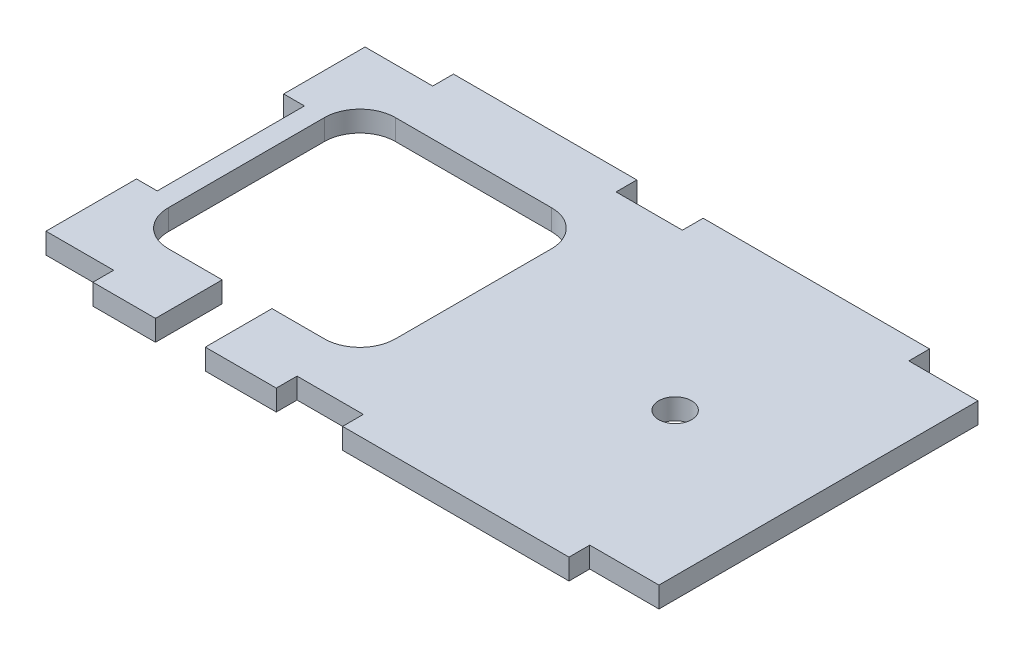
ISO-10303-21;
HEADER;
FILE_DESCRIPTION(('STEP AP214'),'2;1');
FILE_NAME('part.step','',(''),(''),'','','');
FILE_SCHEMA(('AUTOMOTIVE_DESIGN { 1 0 10303 214 1 1 1 1 }'));
ENDSEC;
DATA;
#1=APPLICATION_CONTEXT('core data for automotive mechanical design processes');
#2=APPLICATION_PROTOCOL_DEFINITION('international standard','automotive_design',2000,#1);
#3=PRODUCT_CONTEXT('',#1,'mechanical');
#4=PRODUCT('Part','Part','',(#3));
#5=PRODUCT_RELATED_PRODUCT_CATEGORY('part','',(#4));
#6=PRODUCT_DEFINITION_FORMATION('','',#4);
#7=PRODUCT_DEFINITION_CONTEXT('part definition',#1,'design');
#8=PRODUCT_DEFINITION('design','',#6,#7);
#9=PRODUCT_DEFINITION_SHAPE('','',#8);
#10=(LENGTH_UNIT() NAMED_UNIT(*) SI_UNIT(.MILLI.,.METRE.));
#11=(NAMED_UNIT(*) PLANE_ANGLE_UNIT() SI_UNIT($,.RADIAN.));
#12=(NAMED_UNIT(*) SI_UNIT($,.STERADIAN.) SOLID_ANGLE_UNIT());
#13=UNCERTAINTY_MEASURE_WITH_UNIT(LENGTH_MEASURE(1.E-05),#10,'distance_accuracy_value','');
#14=(GEOMETRIC_REPRESENTATION_CONTEXT(3) GLOBAL_UNCERTAINTY_ASSIGNED_CONTEXT((#13)) GLOBAL_UNIT_ASSIGNED_CONTEXT((#10,
#11,#12)) REPRESENTATION_CONTEXT('',''));
#15=CARTESIAN_POINT('',(0.,0.,0.));
#16=DIRECTION('',(0.,0.,1.));
#17=DIRECTION('',(1.,0.,0.));
#18=AXIS2_PLACEMENT_3D('',#15,#16,#17);
#19=CARTESIAN_POINT('',(86.36,0.,-50.8));
#20=DIRECTION('',(0.,-1.,0.));
#21=DIRECTION('',(0.,0.,-1.));
#22=AXIS2_PLACEMENT_3D('',#19,#20,#21);
#23=PLANE('',#22);
#24=DIRECTION('',(1.,0.,0.));
#25=VECTOR('',#24,1.);
#26=CARTESIAN_POINT('',(86.36,0.,-22.0231196297328));
#27=LINE('',#26,#25);
#28=CARTESIAN_POINT('',(-86.36,0.,-22.0231196297328));
#29=VERTEX_POINT('',#28);
#30=CARTESIAN_POINT('',(-80.51,0.,-22.0231196297328));
#31=VERTEX_POINT('',#30);
#32=EDGE_CURVE('E389',#29,#31,#27,.T.);
#33=ORIENTED_EDGE('',*,*,#32,.F.);
#34=DIRECTION('',(0.,0.,1.));
#35=VECTOR('',#34,1.);
#36=CARTESIAN_POINT('',(-86.36,0.,50.8));
#37=LINE('',#36,#35);
#38=CARTESIAN_POINT('',(-86.36,0.,-44.95));
#39=VERTEX_POINT('',#38);
#40=EDGE_CURVE('E537',#39,#29,#37,.T.);
#41=ORIENTED_EDGE('',*,*,#40,.F.);
#42=DIRECTION('',(1.,0.,0.));
#43=VECTOR('',#42,1.);
#44=CARTESIAN_POINT('',(86.36,0.,-44.95));
#45=LINE('',#44,#43);
#46=CARTESIAN_POINT('',(-67.2933113520948,0.,-44.95));
#47=VERTEX_POINT('',#46);
#48=EDGE_CURVE('E556',#39,#47,#45,.T.);
#49=ORIENTED_EDGE('',*,*,#48,.T.);
#50=DIRECTION('',(0.,0.,-1.));
#51=VECTOR('',#50,1.);
#52=CARTESIAN_POINT('',(-67.2933113520947,0.,-50.8));
#53=LINE('',#52,#51);
#54=CARTESIAN_POINT('',(-67.2933113520948,0.,-50.8));
#55=VERTEX_POINT('',#54);
#56=EDGE_CURVE('E401',#47,#55,#53,.T.);
#57=ORIENTED_EDGE('',*,*,#56,.T.);
#58=DIRECTION('',(-1.,0.,0.));
#59=VECTOR('',#58,1.);
#60=CARTESIAN_POINT('',(-86.36,0.,-50.8));
#61=LINE('',#60,#59);
#62=CARTESIAN_POINT('',(-15.6247389259285,0.,-50.8));
#63=VERTEX_POINT('',#62);
#64=EDGE_CURVE('E539',#63,#55,#61,.T.);
#65=ORIENTED_EDGE('',*,*,#64,.F.);
#66=DIRECTION('',(0.,0.,1.));
#67=VECTOR('',#66,1.);
#68=CARTESIAN_POINT('',(-15.6247389259285,0.,-50.8));
#69=LINE('',#68,#67);
#70=CARTESIAN_POINT('',(-15.6247389259285,0.,-44.95));
#71=VERTEX_POINT('',#70);
#72=EDGE_CURVE('E398',#63,#71,#69,.T.);
#73=ORIENTED_EDGE('',*,*,#72,.T.);
#74=CARTESIAN_POINT('',(3.06081199953051,0.,-44.95));
#75=VERTEX_POINT('',#74);
#76=EDGE_CURVE('E554',#71,#75,#45,.T.);
#77=ORIENTED_EDGE('',*,*,#76,.T.);
#78=DIRECTION('',(0.,0.,-1.));
#79=VECTOR('',#78,1.);
#80=CARTESIAN_POINT('',(3.06081199953051,0.,-50.8));
#81=LINE('',#80,#79);
#82=CARTESIAN_POINT('',(3.06081199953051,0.,-50.8));
#83=VERTEX_POINT('',#82);
#84=EDGE_CURVE('E395',#75,#83,#81,.T.);
#85=ORIENTED_EDGE('',*,*,#84,.T.);
#86=CARTESIAN_POINT('',(66.8582900899251,0.,-50.8));
#87=VERTEX_POINT('',#86);
#88=EDGE_CURVE('E538',#87,#83,#61,.T.);
#89=ORIENTED_EDGE('',*,*,#88,.F.);
#90=DIRECTION('',(0.,0.,1.));
#91=VECTOR('',#90,1.);
#92=CARTESIAN_POINT('',(66.8582900899251,0.,-50.8));
#93=LINE('',#92,#91);
#94=CARTESIAN_POINT('',(66.8582900899251,0.,-44.95));
#95=VERTEX_POINT('',#94);
#96=EDGE_CURVE('E392',#87,#95,#93,.T.);
#97=ORIENTED_EDGE('',*,*,#96,.T.);
#98=CARTESIAN_POINT('',(86.36,0.,-44.95));
#99=VERTEX_POINT('',#98);
#100=EDGE_CURVE('E550',#95,#99,#45,.T.);
#101=ORIENTED_EDGE('',*,*,#100,.T.);
#102=DIRECTION('',(0.,0.,-1.));
#103=VECTOR('',#102,1.);
#104=CARTESIAN_POINT('',(86.36,0.,50.8));
#105=LINE('',#104,#103);
#106=CARTESIAN_POINT('',(86.36,0.,44.95));
#107=VERTEX_POINT('',#106);
#108=EDGE_CURVE('E479',#107,#99,#105,.T.);
#109=ORIENTED_EDGE('',*,*,#108,.F.);
#110=DIRECTION('',(1.,0.,0.));
#111=VECTOR('',#110,1.);
#112=CARTESIAN_POINT('',(86.36,0.,44.95));
#113=LINE('',#112,#111);
#114=CARTESIAN_POINT('',(66.8582900899251,0.,44.95));
#115=VERTEX_POINT('',#114);
#116=EDGE_CURVE('E54',#115,#107,#113,.T.);
#117=ORIENTED_EDGE('',*,*,#116,.F.);
#118=DIRECTION('',(0.,0.,1.));
#119=VECTOR('',#118,1.);
#120=CARTESIAN_POINT('',(66.8582900899251,0.,-50.8));
#121=LINE('',#120,#119);
#122=CARTESIAN_POINT('',(66.8582900899251,0.,50.8));
#123=VERTEX_POINT('',#122);
#124=EDGE_CURVE('E407',#115,#123,#121,.T.);
#125=ORIENTED_EDGE('',*,*,#124,.T.);
#126=DIRECTION('',(1.,0.,0.));
#127=VECTOR('',#126,1.);
#128=CARTESIAN_POINT('',(-86.36,0.,50.8));
#129=LINE('',#128,#127);
#130=CARTESIAN_POINT('',(3.06081199953051,0.,50.8));
#131=VERTEX_POINT('',#130);
#132=EDGE_CURVE('E292',#131,#123,#129,.T.);
#133=ORIENTED_EDGE('',*,*,#132,.F.);
#134=DIRECTION('',(0.,0.,-1.));
#135=VECTOR('',#134,1.);
#136=CARTESIAN_POINT('',(3.06081199953051,0.,-50.8));
#137=LINE('',#136,#135);
#138=CARTESIAN_POINT('',(3.06081199953051,0.,44.95));
#139=VERTEX_POINT('',#138);
#140=EDGE_CURVE('E46',#131,#139,#137,.T.);
#141=ORIENTED_EDGE('',*,*,#140,.T.);
#142=CARTESIAN_POINT('',(-15.6247389259285,0.,44.95));
#143=VERTEX_POINT('',#142);
#144=EDGE_CURVE('E591',#143,#139,#113,.T.);
#145=ORIENTED_EDGE('',*,*,#144,.F.);
#146=DIRECTION('',(0.,0.,1.));
#147=VECTOR('',#146,1.);
#148=CARTESIAN_POINT('',(-15.6247389259285,0.,-50.8));
#149=LINE('',#148,#147);
#150=CARTESIAN_POINT('',(-15.6247389259285,0.,50.8));
#151=VERTEX_POINT('',#150);
#152=EDGE_CURVE('E410',#143,#151,#149,.T.);
#153=ORIENTED_EDGE('',*,*,#152,.T.);
#154=CARTESIAN_POINT('',(-35.6279249055484,0.,50.8));
#155=VERTEX_POINT('',#154);
#156=EDGE_CURVE('E533',#155,#151,#129,.T.);
#157=ORIENTED_EDGE('',*,*,#156,.F.);
#158=DIRECTION('',(0.,0.,-1.));
#159=VECTOR('',#158,1.);
#160=CARTESIAN_POINT('',(-35.6279249055484,0.,32.));
#161=LINE('',#160,#159);
#162=CARTESIAN_POINT('',(-35.6279249055484,0.,32.));
#163=VERTEX_POINT('',#162);
#164=EDGE_CURVE('E440',#155,#163,#161,.T.);
#165=ORIENTED_EDGE('',*,*,#164,.T.);
#166=DIRECTION('',(1.,0.,0.));
#167=VECTOR('',#166,1.);
#168=CARTESIAN_POINT('',(-10.8508253354387,0.,32.));
#169=LINE('',#168,#167);
#170=CARTESIAN_POINT('',(-20.8508253354387,0.,32.));
#171=VERTEX_POINT('',#170);
#172=EDGE_CURVE('E443',#163,#171,#169,.T.);
#173=ORIENTED_EDGE('',*,*,#172,.T.);
#174=CARTESIAN_POINT('',(-20.8508253354387,0.,22.));
#175=DIRECTION('',(0.,-1.,0.));
#176=DIRECTION('',(0.,0.,-1.));
#177=AXIS2_PLACEMENT_3D('',#174,#175,#176);
#178=CIRCLE('',#177,10.);
#179=CARTESIAN_POINT('',(-10.8508253354387,0.,22.));
#180=VERTEX_POINT('',#179);
#181=EDGE_CURVE('E506',#171,#180,#178,.F.);
#182=ORIENTED_EDGE('',*,*,#181,.T.);
#183=DIRECTION('',(0.,0.,-1.));
#184=VECTOR('',#183,1.);
#185=CARTESIAN_POINT('',(-10.8508253354387,0.,-32.));
#186=LINE('',#185,#184);
#187=CARTESIAN_POINT('',(-10.8508253354387,0.,-22.));
#188=VERTEX_POINT('',#187);
#189=EDGE_CURVE('E446',#180,#188,#186,.T.);
#190=ORIENTED_EDGE('',*,*,#189,.T.);
#191=CARTESIAN_POINT('',(-20.8508253354387,0.,-22.));
#192=DIRECTION('',(0.,-1.,0.));
#193=DIRECTION('',(0.,0.,-1.));
#194=AXIS2_PLACEMENT_3D('',#191,#192,#193);
#195=CIRCLE('',#194,10.);
#196=CARTESIAN_POINT('',(-20.8508253354387,0.,-32.));
#197=VERTEX_POINT('',#196);
#198=EDGE_CURVE('E502',#188,#197,#195,.F.);
#199=ORIENTED_EDGE('',*,*,#198,.T.);
#200=DIRECTION('',(-1.,0.,0.));
#201=VECTOR('',#200,1.);
#202=CARTESIAN_POINT('',(-74.8508253354387,0.,-32.));
#203=LINE('',#202,#201);
#204=CARTESIAN_POINT('',(-64.8508253354387,0.,-32.));
#205=VERTEX_POINT('',#204);
#206=EDGE_CURVE('E429',#197,#205,#203,.T.);
#207=ORIENTED_EDGE('',*,*,#206,.T.);
#208=CARTESIAN_POINT('',(-64.8508253354387,0.,-22.));
#209=DIRECTION('',(0.,-1.,0.));
#210=DIRECTION('',(0.,0.,-1.));
#211=AXIS2_PLACEMENT_3D('',#208,#209,#210);
#212=CIRCLE('',#211,10.);
#213=CARTESIAN_POINT('',(-74.8508253354387,0.,-22.));
#214=VERTEX_POINT('',#213);
#215=EDGE_CURVE('E498',#205,#214,#212,.F.);
#216=ORIENTED_EDGE('',*,*,#215,.T.);
#217=DIRECTION('',(0.,0.,1.));
#218=VECTOR('',#217,1.);
#219=CARTESIAN_POINT('',(-74.8508253354387,0.,32.));
#220=LINE('',#219,#218);
#221=CARTESIAN_POINT('',(-74.8508253354387,0.,22.));
#222=VERTEX_POINT('',#221);
#223=EDGE_CURVE('E432',#214,#222,#220,.T.);
#224=ORIENTED_EDGE('',*,*,#223,.T.);
#225=CARTESIAN_POINT('',(-64.8508253354387,0.,22.));
#226=DIRECTION('',(0.,-1.,0.));
#227=DIRECTION('',(0.,0.,-1.));
#228=AXIS2_PLACEMENT_3D('',#225,#226,#227);
#229=CIRCLE('',#228,10.);
#230=CARTESIAN_POINT('',(-64.8508253354387,0.,32.));
#231=VERTEX_POINT('',#230);
#232=EDGE_CURVE('E510',#222,#231,#229,.F.);
#233=ORIENTED_EDGE('',*,*,#232,.T.);
#234=DIRECTION('',(1.,0.,0.));
#235=VECTOR('',#234,1.);
#236=CARTESIAN_POINT('',(-49.6595750944517,0.,32.));
#237=LINE('',#236,#235);
#238=CARTESIAN_POINT('',(-49.6595750944517,0.,32.));
#239=VERTEX_POINT('',#238);
#240=EDGE_CURVE('E435',#231,#239,#237,.T.);
#241=ORIENTED_EDGE('',*,*,#240,.T.);
#242=DIRECTION('',(0.,0.,1.));
#243=VECTOR('',#242,1.);
#244=CARTESIAN_POINT('',(-49.6595750944517,0.,32.));
#245=LINE('',#244,#243);
#246=CARTESIAN_POINT('',(-49.6595750944517,0.,50.8));
#247=VERTEX_POINT('',#246);
#248=EDGE_CURVE('E437',#239,#247,#245,.T.);
#249=ORIENTED_EDGE('',*,*,#248,.T.);
#250=CARTESIAN_POINT('',(-67.2933113520948,0.,50.8));
#251=VERTEX_POINT('',#250);
#252=EDGE_CURVE('E484',#251,#247,#129,.T.);
#253=ORIENTED_EDGE('',*,*,#252,.F.);
#254=DIRECTION('',(0.,0.,-1.));
#255=VECTOR('',#254,1.);
#256=CARTESIAN_POINT('',(-67.2933113520947,0.,-50.8));
#257=LINE('',#256,#255);
#258=CARTESIAN_POINT('',(-67.2933113520948,0.,44.95));
#259=VERTEX_POINT('',#258);
#260=EDGE_CURVE('E413',#251,#259,#257,.T.);
#261=ORIENTED_EDGE('',*,*,#260,.T.);
#262=CARTESIAN_POINT('',(-86.36,0.,44.95));
#263=VERTEX_POINT('',#262);
#264=EDGE_CURVE('E587',#263,#259,#113,.T.);
#265=ORIENTED_EDGE('',*,*,#264,.F.);
#266=CARTESIAN_POINT('',(-86.36,0.,19.4523274550558));
#267=VERTEX_POINT('',#266);
#268=EDGE_CURVE('E534',#267,#263,#37,.T.);
#269=ORIENTED_EDGE('',*,*,#268,.F.);
#270=DIRECTION('',(-1.,0.,0.));
#271=VECTOR('',#270,1.);
#272=CARTESIAN_POINT('',(86.36,0.,19.4523274550558));
#273=LINE('',#272,#271);
#274=CARTESIAN_POINT('',(-80.51,0.,19.4523274550558));
#275=VERTEX_POINT('',#274);
#276=EDGE_CURVE('E387',#275,#267,#273,.T.);
#277=ORIENTED_EDGE('',*,*,#276,.F.);
#278=DIRECTION('',(0.,0.,1.));
#279=VECTOR('',#278,1.);
#280=CARTESIAN_POINT('',(-80.51,0.,-50.8));
#281=LINE('',#280,#279);
#282=EDGE_CURVE('E11',#31,#275,#281,.T.);
#283=ORIENTED_EDGE('',*,*,#282,.F.);
#284=EDGE_LOOP('',(#33,#41,#49,#57,#65,#73,#77,#85,#89,#97,#101,#109,#117,#125,#133,#141,#145,
#153,#157,#165,#173,#182,#190,#199,#207,#216,#224,#233,#241,#249,#253,#261,#265,#269,#277,#283));
#285=FACE_BOUND('',#284,.T.);
#286=CARTESIAN_POINT('',(45.9739194,0.,0.));
#287=DIRECTION('',(0.,1.,0.));
#288=DIRECTION('',(0.,0.,1.));
#289=AXIS2_PLACEMENT_3D('',#286,#287,#288);
#290=CIRCLE('',#289,4.635);
#291=CARTESIAN_POINT('',(45.9739194,0.,4.635));
#292=VERTEX_POINT('',#291);
#293=EDGE_CURVE('E421',#292,#292,#290,.T.);
#294=ORIENTED_EDGE('',*,*,#293,.T.);
#295=EDGE_LOOP('',(#294));
#296=FACE_BOUND('',#295,.T.);
#297=ADVANCED_FACE('F31',(#285,#296),#23,.T.);
#298=CARTESIAN_POINT('',(-86.36,5.85,50.8));
#299=DIRECTION('',(0.,0.,-1.));
#300=DIRECTION('',(-1.,0.,0.));
#301=AXIS2_PLACEMENT_3D('',#298,#299,#300);
#302=PLANE('',#301);
#303=DIRECTION('',(0.,-1.,0.));
#304=VECTOR('',#303,1.);
#305=CARTESIAN_POINT('',(-67.2933113520948,5.85000000000006,50.8));
#306=LINE('',#305,#304);
#307=CARTESIAN_POINT('',(-67.2933113520948,5.85,50.8));
#308=VERTEX_POINT('',#307);
#309=EDGE_CURVE('E310',#308,#251,#306,.T.);
#310=ORIENTED_EDGE('',*,*,#309,.T.);
#311=ORIENTED_EDGE('',*,*,#252,.T.);
#312=DIRECTION('',(0.,-1.,0.));
#313=VECTOR('',#312,1.);
#314=CARTESIAN_POINT('',(-49.6595750944517,20.,50.8));
#315=LINE('',#314,#313);
#316=CARTESIAN_POINT('',(-49.6595750944517,5.85,50.8));
#317=VERTEX_POINT('',#316);
#318=EDGE_CURVE('E454',#317,#247,#315,.T.);
#319=ORIENTED_EDGE('',*,*,#318,.F.);
#320=DIRECTION('',(1.,0.,0.));
#321=VECTOR('',#320,1.);
#322=CARTESIAN_POINT('',(-86.36,5.85,50.8));
#323=LINE('',#322,#321);
#324=EDGE_CURVE('E281',#308,#317,#323,.T.);
#325=ORIENTED_EDGE('',*,*,#324,.F.);
#326=EDGE_LOOP('',(#310,#311,#319,#325));
#327=FACE_BOUND('',#326,.T.);
#328=ADVANCED_FACE('F643',(#327),#302,.F.);
#329=DIRECTION('',(0.,1.,0.));
#330=VECTOR('',#329,1.);
#331=CARTESIAN_POINT('',(-15.6247389259285,5.85000000000006,50.8));
#332=LINE('',#331,#330);
#333=CARTESIAN_POINT('',(-15.6247389259285,5.85000000000006,50.8));
#334=VERTEX_POINT('',#333);
#335=EDGE_CURVE('E301',#151,#334,#332,.T.);
#336=ORIENTED_EDGE('',*,*,#335,.T.);
#337=CARTESIAN_POINT('',(-35.6279249055484,5.85,50.8));
#338=VERTEX_POINT('',#337);
#339=EDGE_CURVE('E278',#338,#334,#323,.T.);
#340=ORIENTED_EDGE('',*,*,#339,.F.);
#341=DIRECTION('',(0.,-1.,0.));
#342=VECTOR('',#341,1.);
#343=CARTESIAN_POINT('',(-35.6279249055484,20.,50.8));
#344=LINE('',#343,#342);
#345=EDGE_CURVE('E451',#338,#155,#344,.T.);
#346=ORIENTED_EDGE('',*,*,#345,.T.);
#347=ORIENTED_EDGE('',*,*,#156,.T.);
#348=EDGE_LOOP('',(#336,#340,#346,#347));
#349=FACE_BOUND('',#348,.T.);
#350=ADVANCED_FACE('F648',(#349),#302,.F.);
#351=DIRECTION('',(0.,-1.,0.));
#352=VECTOR('',#351,1.);
#353=CARTESIAN_POINT('',(3.06081199953051,5.85000000000006,50.8));
#354=LINE('',#353,#352);
#355=CARTESIAN_POINT('',(3.06081199953051,5.85000000000006,50.8));
#356=VERTEX_POINT('',#355);
#357=EDGE_CURVE('E296',#356,#131,#354,.T.);
#358=ORIENTED_EDGE('',*,*,#357,.T.);
#359=ORIENTED_EDGE('',*,*,#132,.T.);
#360=DIRECTION('',(0.,1.,0.));
#361=VECTOR('',#360,1.);
#362=CARTESIAN_POINT('',(66.8582900899251,5.85000000000006,50.8));
#363=LINE('',#362,#361);
#364=CARTESIAN_POINT('',(66.8582900899251,5.85000000000006,50.8));
#365=VERTEX_POINT('',#364);
#366=EDGE_CURVE('E285',#123,#365,#363,.T.);
#367=ORIENTED_EDGE('',*,*,#366,.T.);
#368=EDGE_CURVE('E266',#356,#365,#323,.T.);
#369=ORIENTED_EDGE('',*,*,#368,.F.);
#370=EDGE_LOOP('',(#358,#359,#367,#369));
#371=FACE_BOUND('',#370,.T.);
#372=ADVANCED_FACE('F290',(#371),#302,.F.);
#373=CARTESIAN_POINT('',(86.36,5.85,50.8));
#374=DIRECTION('',(-1.,0.,0.));
#375=DIRECTION('',(0.,0.,1.));
#376=AXIS2_PLACEMENT_3D('',#373,#374,#375);
#377=PLANE('',#376);
#378=DIRECTION('',(0.,1.,0.));
#379=VECTOR('',#378,1.);
#380=CARTESIAN_POINT('',(86.36,5.85000000000006,-44.95));
#381=LINE('',#380,#379);
#382=CARTESIAN_POINT('',(86.36,5.85,-44.95));
#383=VERTEX_POINT('',#382);
#384=EDGE_CURVE('E348',#99,#383,#381,.T.);
#385=ORIENTED_EDGE('',*,*,#384,.T.);
#386=DIRECTION('',(0.,0.,-1.));
#387=VECTOR('',#386,1.);
#388=CARTESIAN_POINT('',(86.36,5.85,50.8));
#389=LINE('',#388,#387);
#390=CARTESIAN_POINT('',(86.36,5.85,44.95));
#391=VERTEX_POINT('',#390);
#392=EDGE_CURVE('E480',#391,#383,#389,.T.);
#393=ORIENTED_EDGE('',*,*,#392,.F.);
#394=DIRECTION('',(0.,1.,0.));
#395=VECTOR('',#394,1.);
#396=CARTESIAN_POINT('',(86.36,5.85000000000006,44.95));
#397=LINE('',#396,#395);
#398=EDGE_CURVE('E313',#107,#391,#397,.T.);
#399=ORIENTED_EDGE('',*,*,#398,.F.);
#400=ORIENTED_EDGE('',*,*,#108,.T.);
#401=EDGE_LOOP('',(#385,#393,#399,#400));
#402=FACE_BOUND('',#401,.T.);
#403=ADVANCED_FACE('F544',(#402),#377,.F.);
#404=CARTESIAN_POINT('',(-86.36,5.85,-50.8));
#405=DIRECTION('',(0.,0.,1.));
#406=DIRECTION('',(1.,0.,0.));
#407=AXIS2_PLACEMENT_3D('',#404,#405,#406);
#408=PLANE('',#407);
#409=DIRECTION('',(0.,1.,0.));
#410=VECTOR('',#409,1.);
#411=CARTESIAN_POINT('',(-67.2933113520948,82.0500000000001,-50.8));
#412=LINE('',#411,#410);
#413=CARTESIAN_POINT('',(-67.2933113520948,5.84999999999999,-50.8));
#414=VERTEX_POINT('',#413);
#415=EDGE_CURVE('E354',#55,#414,#412,.T.);
#416=ORIENTED_EDGE('',*,*,#415,.T.);
#417=DIRECTION('',(-1.,0.,0.));
#418=VECTOR('',#417,1.);
#419=CARTESIAN_POINT('',(-86.36,5.85,-50.8));
#420=LINE('',#419,#418);
#421=CARTESIAN_POINT('',(-15.6247389259285,5.85000000000006,-50.8));
#422=VERTEX_POINT('',#421);
#423=EDGE_CURVE('E483',#422,#414,#420,.T.);
#424=ORIENTED_EDGE('',*,*,#423,.F.);
#425=DIRECTION('',(0.,-1.,0.));
#426=VECTOR('',#425,1.);
#427=CARTESIAN_POINT('',(-15.6247389259285,82.0500000000001,-50.8));
#428=LINE('',#427,#426);
#429=EDGE_CURVE('E342',#422,#63,#428,.T.);
#430=ORIENTED_EDGE('',*,*,#429,.T.);
#431=ORIENTED_EDGE('',*,*,#64,.T.);
#432=EDGE_LOOP('',(#416,#424,#430,#431));
#433=FACE_BOUND('',#432,.T.);
#434=ADVANCED_FACE('F619',(#433),#408,.F.);
#435=DIRECTION('',(0.,1.,0.));
#436=VECTOR('',#435,1.);
#437=CARTESIAN_POINT('',(3.06081199953049,82.05,-50.8));
#438=LINE('',#437,#436);
#439=CARTESIAN_POINT('',(3.06081199953051,5.85,-50.8));
#440=VERTEX_POINT('',#439);
#441=EDGE_CURVE('E334',#83,#440,#438,.T.);
#442=ORIENTED_EDGE('',*,*,#441,.T.);
#443=CARTESIAN_POINT('',(66.8582900899251,5.85000000000006,-50.8));
#444=VERTEX_POINT('',#443);
#445=EDGE_CURVE('E486',#444,#440,#420,.T.);
#446=ORIENTED_EDGE('',*,*,#445,.F.);
#447=DIRECTION('',(0.,-1.,0.));
#448=VECTOR('',#447,1.);
#449=CARTESIAN_POINT('',(66.8582900899251,82.0500000000001,-50.8));
#450=LINE('',#449,#448);
#451=EDGE_CURVE('E325',#444,#87,#450,.T.);
#452=ORIENTED_EDGE('',*,*,#451,.T.);
#453=ORIENTED_EDGE('',*,*,#88,.T.);
#454=EDGE_LOOP('',(#442,#446,#452,#453));
#455=FACE_BOUND('',#454,.T.);
#456=ADVANCED_FACE('F624',(#455),#408,.F.);
#457=CARTESIAN_POINT('',(-86.36,5.85,50.8));
#458=DIRECTION('',(1.,0.,0.));
#459=DIRECTION('',(0.,0.,-1.));
#460=AXIS2_PLACEMENT_3D('',#457,#458,#459);
#461=PLANE('',#460);
#462=ORIENTED_EDGE('',*,*,#40,.T.);
#463=DIRECTION('',(0.,-1.,0.));
#464=VECTOR('',#463,1.);
#465=CARTESIAN_POINT('',(-86.36,5.85000000000006,-22.0231196297328));
#466=LINE('',#465,#464);
#467=CARTESIAN_POINT('',(-86.36,5.85000000000006,-22.0231196297328));
#468=VERTEX_POINT('',#467);
#469=EDGE_CURVE('E360',#468,#29,#466,.T.);
#470=ORIENTED_EDGE('',*,*,#469,.F.);
#471=DIRECTION('',(0.,0.,1.));
#472=VECTOR('',#471,1.);
#473=CARTESIAN_POINT('',(-86.36,5.85,50.8));
#474=LINE('',#473,#472);
#475=CARTESIAN_POINT('',(-86.36,5.85000000000006,-44.95));
#476=VERTEX_POINT('',#475);
#477=EDGE_CURVE('E279',#476,#468,#474,.T.);
#478=ORIENTED_EDGE('',*,*,#477,.F.);
#479=DIRECTION('',(0.,-1.,0.));
#480=VECTOR('',#479,1.);
#481=CARTESIAN_POINT('',(-86.36,5.85000000000006,-44.95));
#482=LINE('',#481,#480);
#483=EDGE_CURVE('E351',#476,#39,#482,.T.);
#484=ORIENTED_EDGE('',*,*,#483,.T.);
#485=EDGE_LOOP('',(#462,#470,#478,#484));
#486=FACE_BOUND('',#485,.T.);
#487=ADVANCED_FACE('F601',(#486),#461,.F.);
#488=CARTESIAN_POINT('',(-86.36,5.85000000000006,19.4523274550558));
#489=VERTEX_POINT('',#488);
#490=CARTESIAN_POINT('',(-86.36,5.85,44.95));
#491=VERTEX_POINT('',#490);
#492=EDGE_CURVE('E491',#489,#491,#474,.T.);
#493=ORIENTED_EDGE('',*,*,#492,.F.);
#494=DIRECTION('',(0.,-1.,0.));
#495=VECTOR('',#494,1.);
#496=CARTESIAN_POINT('',(-86.36,5.85,19.4523274550558));
#497=LINE('',#496,#495);
#498=EDGE_CURVE('E39',#489,#267,#497,.T.);
#499=ORIENTED_EDGE('',*,*,#498,.T.);
#500=ORIENTED_EDGE('',*,*,#268,.T.);
#501=DIRECTION('',(0.,-1.,0.));
#502=VECTOR('',#501,1.);
#503=CARTESIAN_POINT('',(-86.36,5.85000000000006,44.95));
#504=LINE('',#503,#502);
#505=EDGE_CURVE('E315',#491,#263,#504,.T.);
#506=ORIENTED_EDGE('',*,*,#505,.F.);
#507=EDGE_LOOP('',(#493,#499,#500,#506));
#508=FACE_BOUND('',#507,.T.);
#509=ADVANCED_FACE('F582',(#508),#461,.F.);
#510=CARTESIAN_POINT('',(86.36,5.85,-50.8));
#511=DIRECTION('',(0.,-1.,0.));
#512=DIRECTION('',(0.,0.,-1.));
#513=AXIS2_PLACEMENT_3D('',#510,#511,#512);
#514=PLANE('',#513);
#515=DIRECTION('',(1.,0.,0.));
#516=VECTOR('',#515,1.);
#517=CARTESIAN_POINT('',(86.36,5.85,-44.95));
#518=LINE('',#517,#516);
#519=CARTESIAN_POINT('',(-15.6247389259285,5.85000000000006,-44.95));
#520=VERTEX_POINT('',#519);
#521=CARTESIAN_POINT('',(3.06081199953051,5.85000000000006,-44.95));
#522=VERTEX_POINT('',#521);
#523=EDGE_CURVE('E390',#520,#522,#518,.T.);
#524=ORIENTED_EDGE('',*,*,#523,.F.);
#525=DIRECTION('',(0.,0.,1.));
#526=VECTOR('',#525,1.);
#527=CARTESIAN_POINT('',(-15.6247389259285,5.85000000000006,-54.95));
#528=LINE('',#527,#526);
#529=EDGE_CURVE('E339',#422,#520,#528,.T.);
#530=ORIENTED_EDGE('',*,*,#529,.F.);
#531=ORIENTED_EDGE('',*,*,#423,.T.);
#532=DIRECTION('',(0.,0.,-1.));
#533=VECTOR('',#532,1.);
#534=CARTESIAN_POINT('',(-67.2933113520947,5.85,-50.8));
#535=LINE('',#534,#533);
#536=CARTESIAN_POINT('',(-67.2933113520948,5.85,-44.95));
#537=VERTEX_POINT('',#536);
#538=EDGE_CURVE('E404',#537,#414,#535,.T.);
#539=ORIENTED_EDGE('',*,*,#538,.F.);
#540=DIRECTION('',(-1.,0.,0.));
#541=VECTOR('',#540,1.);
#542=CARTESIAN_POINT('',(-86.36,5.85000000000006,-44.95));
#543=LINE('',#542,#541);
#544=EDGE_CURVE('E357',#537,#476,#543,.T.);
#545=ORIENTED_EDGE('',*,*,#544,.T.);
#546=ORIENTED_EDGE('',*,*,#477,.T.);
#547=DIRECTION('',(-1.,0.,0.));
#548=VECTOR('',#547,1.);
#549=CARTESIAN_POINT('',(-80.51,5.85000000000006,-22.0231196297328));
#550=LINE('',#549,#548);
#551=CARTESIAN_POINT('',(-80.51,5.85000000000006,-22.0231196297328));
#552=VERTEX_POINT('',#551);
#553=EDGE_CURVE('E366',#552,#468,#550,.T.);
#554=ORIENTED_EDGE('',*,*,#553,.F.);
#555=DIRECTION('',(0.,0.,1.));
#556=VECTOR('',#555,1.);
#557=CARTESIAN_POINT('',(-80.51,5.85,-50.8));
#558=LINE('',#557,#556);
#559=CARTESIAN_POINT('',(-80.51,5.85000000000006,19.4523274550558));
#560=VERTEX_POINT('',#559);
#561=EDGE_CURVE('E418',#552,#560,#558,.T.);
#562=ORIENTED_EDGE('',*,*,#561,.T.);
#563=DIRECTION('',(-1.,0.,0.));
#564=VECTOR('',#563,1.);
#565=CARTESIAN_POINT('',(-80.51,5.85000000000006,19.4523274550558));
#566=LINE('',#565,#564);
#567=EDGE_CURVE('E369',#560,#489,#566,.T.);
#568=ORIENTED_EDGE('',*,*,#567,.T.);
#569=ORIENTED_EDGE('',*,*,#492,.T.);
#570=DIRECTION('',(1.,0.,0.));
#571=VECTOR('',#570,1.);
#572=CARTESIAN_POINT('',(86.36,5.85,44.95));
#573=LINE('',#572,#571);
#574=CARTESIAN_POINT('',(-67.2933113520948,5.84999999999999,44.95));
#575=VERTEX_POINT('',#574);
#576=EDGE_CURVE('E555',#491,#575,#573,.T.);
#577=ORIENTED_EDGE('',*,*,#576,.T.);
#578=DIRECTION('',(0.,0.,-1.));
#579=VECTOR('',#578,1.);
#580=CARTESIAN_POINT('',(-67.2933113520947,5.85,-50.8));
#581=LINE('',#580,#579);
#582=EDGE_CURVE('E416',#308,#575,#581,.T.);
#583=ORIENTED_EDGE('',*,*,#582,.F.);
#584=ORIENTED_EDGE('',*,*,#324,.T.);
#585=DIRECTION('',(0.,0.,1.));
#586=VECTOR('',#585,1.);
#587=CARTESIAN_POINT('',(-49.6595750944517,5.85,-50.7999999999999));
#588=LINE('',#587,#586);
#589=CARTESIAN_POINT('',(-49.6595750944517,5.85,32.));
#590=VERTEX_POINT('',#589);
#591=EDGE_CURVE('E468',#590,#317,#588,.T.);
#592=ORIENTED_EDGE('',*,*,#591,.F.);
#593=DIRECTION('',(1.,0.,0.));
#594=VECTOR('',#593,1.);
#595=CARTESIAN_POINT('',(86.36,5.85,32.));
#596=LINE('',#595,#594);
#597=CARTESIAN_POINT('',(-64.8508253354387,5.85,32.));
#598=VERTEX_POINT('',#597);
#599=EDGE_CURVE('E471',#598,#590,#596,.T.);
#600=ORIENTED_EDGE('',*,*,#599,.F.);
#601=CARTESIAN_POINT('',(-64.8508253354387,5.85,22.));
#602=DIRECTION('',(0.,-1.,0.));
#603=DIRECTION('',(0.,0.,-1.));
#604=AXIS2_PLACEMENT_3D('',#601,#602,#603);
#605=CIRCLE('',#604,10.);
#606=CARTESIAN_POINT('',(-74.8508253354387,5.85,22.));
#607=VERTEX_POINT('',#606);
#608=EDGE_CURVE('E508',#598,#607,#605,.T.);
#609=ORIENTED_EDGE('',*,*,#608,.T.);
#610=DIRECTION('',(0.,0.,1.));
#611=VECTOR('',#610,1.);
#612=CARTESIAN_POINT('',(-74.8508253354387,5.85,-50.8));
#613=LINE('',#612,#611);
#614=CARTESIAN_POINT('',(-74.8508253354387,5.85,-22.));
#615=VERTEX_POINT('',#614);
#616=EDGE_CURVE('E473',#615,#607,#613,.T.);
#617=ORIENTED_EDGE('',*,*,#616,.F.);
#618=CARTESIAN_POINT('',(-64.8508253354387,5.85,-22.));
#619=DIRECTION('',(0.,-1.,0.));
#620=DIRECTION('',(0.,0.,-1.));
#621=AXIS2_PLACEMENT_3D('',#618,#619,#620);
#622=CIRCLE('',#621,10.);
#623=CARTESIAN_POINT('',(-64.8508253354387,5.85,-32.));
#624=VERTEX_POINT('',#623);
#625=EDGE_CURVE('E496',#615,#624,#622,.T.);
#626=ORIENTED_EDGE('',*,*,#625,.T.);
#627=DIRECTION('',(-1.,0.,0.));
#628=VECTOR('',#627,1.);
#629=CARTESIAN_POINT('',(86.36,5.85,-31.9999999999999));
#630=LINE('',#629,#628);
#631=CARTESIAN_POINT('',(-20.8508253354387,5.85,-32.));
#632=VERTEX_POINT('',#631);
#633=EDGE_CURVE('E476',#632,#624,#630,.T.);
#634=ORIENTED_EDGE('',*,*,#633,.F.);
#635=CARTESIAN_POINT('',(-20.8508253354387,5.85,-22.));
#636=DIRECTION('',(0.,-1.,0.));
#637=DIRECTION('',(0.,0.,-1.));
#638=AXIS2_PLACEMENT_3D('',#635,#636,#637);
#639=CIRCLE('',#638,10.);
#640=CARTESIAN_POINT('',(-10.8508253354387,5.85,-22.));
#641=VERTEX_POINT('',#640);
#642=EDGE_CURVE('E500',#632,#641,#639,.T.);
#643=ORIENTED_EDGE('',*,*,#642,.T.);
#644=DIRECTION('',(0.,0.,-1.));
#645=VECTOR('',#644,1.);
#646=CARTESIAN_POINT('',(-10.8508253354387,5.85,-50.8));
#647=LINE('',#646,#645);
#648=CARTESIAN_POINT('',(-10.8508253354387,5.85,22.));
#649=VERTEX_POINT('',#648);
#650=EDGE_CURVE('E460',#649,#641,#647,.T.);
#651=ORIENTED_EDGE('',*,*,#650,.F.);
#652=CARTESIAN_POINT('',(-20.8508253354387,5.85,22.));
#653=DIRECTION('',(0.,-1.,0.));
#654=DIRECTION('',(0.,0.,-1.));
#655=AXIS2_PLACEMENT_3D('',#652,#653,#654);
#656=CIRCLE('',#655,10.);
#657=CARTESIAN_POINT('',(-20.8508253354387,5.85,32.));
#658=VERTEX_POINT('',#657);
#659=EDGE_CURVE('E504',#649,#658,#656,.T.);
#660=ORIENTED_EDGE('',*,*,#659,.T.);
#661=DIRECTION('',(1.,0.,0.));
#662=VECTOR('',#661,1.);
#663=CARTESIAN_POINT('',(86.3599999999999,5.85,32.0000000000001));
#664=LINE('',#663,#662);
#665=CARTESIAN_POINT('',(-35.6279249055484,5.85,32.));
#666=VERTEX_POINT('',#665);
#667=EDGE_CURVE('E463',#666,#658,#664,.T.);
#668=ORIENTED_EDGE('',*,*,#667,.F.);
#669=DIRECTION('',(0.,0.,-1.));
#670=VECTOR('',#669,1.);
#671=CARTESIAN_POINT('',(-35.6279249055484,5.85,-50.7999999999999));
#672=LINE('',#671,#670);
#673=EDGE_CURVE('E466',#338,#666,#672,.T.);
#674=ORIENTED_EDGE('',*,*,#673,.F.);
#675=ORIENTED_EDGE('',*,*,#339,.T.);
#676=DIRECTION('',(0.,0.,1.));
#677=VECTOR('',#676,1.);
#678=CARTESIAN_POINT('',(-15.6247389259285,5.85000000000006,40.8));
#679=LINE('',#678,#677);
#680=CARTESIAN_POINT('',(-15.6247389259285,5.85000000000006,44.95));
#681=VERTEX_POINT('',#680);
#682=EDGE_CURVE('E304',#681,#334,#679,.T.);
#683=ORIENTED_EDGE('',*,*,#682,.F.);
#684=CARTESIAN_POINT('',(3.06081199953051,5.85000000000006,44.95));
#685=VERTEX_POINT('',#684);
#686=EDGE_CURVE('E559',#681,#685,#573,.T.);
#687=ORIENTED_EDGE('',*,*,#686,.T.);
#688=DIRECTION('',(0.,0.,1.));
#689=VECTOR('',#688,1.);
#690=CARTESIAN_POINT('',(3.06081199953051,5.85000000000006,40.8));
#691=LINE('',#690,#689);
#692=EDGE_CURVE('E275',#685,#356,#691,.T.);
#693=ORIENTED_EDGE('',*,*,#692,.T.);
#694=ORIENTED_EDGE('',*,*,#368,.T.);
#695=DIRECTION('',(0.,0.,1.));
#696=VECTOR('',#695,1.);
#697=CARTESIAN_POINT('',(66.8582900899251,5.85000000000006,40.8));
#698=LINE('',#697,#696);
#699=CARTESIAN_POINT('',(66.8582900899251,5.85000000000006,44.95));
#700=VERTEX_POINT('',#699);
#701=EDGE_CURVE('E272',#700,#365,#698,.T.);
#702=ORIENTED_EDGE('',*,*,#701,.F.);
#703=EDGE_CURVE('E560',#700,#391,#573,.T.);
#704=ORIENTED_EDGE('',*,*,#703,.T.);
#705=ORIENTED_EDGE('',*,*,#392,.T.);
#706=CARTESIAN_POINT('',(66.8582900899251,5.85000000000006,-44.95));
#707=VERTEX_POINT('',#706);
#708=EDGE_CURVE('E385',#707,#383,#518,.T.);
#709=ORIENTED_EDGE('',*,*,#708,.F.);
#710=DIRECTION('',(0.,0.,1.));
#711=VECTOR('',#710,1.);
#712=CARTESIAN_POINT('',(66.8582900899251,5.85000000000006,-54.95));
#713=LINE('',#712,#711);
#714=EDGE_CURVE('E322',#444,#707,#713,.T.);
#715=ORIENTED_EDGE('',*,*,#714,.F.);
#716=ORIENTED_EDGE('',*,*,#445,.T.);
#717=DIRECTION('',(0.,0.,1.));
#718=VECTOR('',#717,1.);
#719=CARTESIAN_POINT('',(3.06081199953051,5.85000000000006,-54.95));
#720=LINE('',#719,#718);
#721=EDGE_CURVE('E331',#440,#522,#720,.T.);
#722=ORIENTED_EDGE('',*,*,#721,.T.);
#723=EDGE_LOOP('',(#524,#530,#531,#539,#545,#546,#554,#562,#568,#569,#577,#583,#584,#592,#600,
#609,#617,#626,#634,#643,#651,#660,#668,#674,#675,#683,#687,#693,#694,#702,#704,#705,#709,#715,
#716,#722));
#724=FACE_BOUND('',#723,.T.);
#725=CARTESIAN_POINT('',(45.9739194,5.85,0.));
#726=DIRECTION('',(0.,-1.,0.));
#727=DIRECTION('',(0.,0.,-1.));
#728=AXIS2_PLACEMENT_3D('',#725,#726,#727);
#729=CIRCLE('',#728,4.635);
#730=CARTESIAN_POINT('',(45.9739194,5.85,-4.635));
#731=VERTEX_POINT('',#730);
#732=EDGE_CURVE('E426',#731,#731,#729,.F.);
#733=ORIENTED_EDGE('',*,*,#732,.F.);
#734=EDGE_LOOP('',(#733));
#735=FACE_BOUND('',#734,.T.);
#736=ADVANCED_FACE('F269',(#724,#735),#514,.F.);
#737=CARTESIAN_POINT('',(-74.8508253354387,20.,-32.));
#738=DIRECTION('',(0.,0.,1.));
#739=DIRECTION('',(1.,0.,0.));
#740=AXIS2_PLACEMENT_3D('',#737,#738,#739);
#741=PLANE('',#740);
#742=ORIENTED_EDGE('',*,*,#206,.F.);
#743=DIRECTION('',(0.,-1.,0.));
#744=VECTOR('',#743,1.);
#745=CARTESIAN_POINT('',(-20.8508253354387,5.85,-32.));
#746=LINE('',#745,#744);
#747=EDGE_CURVE('E512',#197,#632,#746,.F.);
#748=ORIENTED_EDGE('',*,*,#747,.T.);
#749=ORIENTED_EDGE('',*,*,#633,.T.);
#750=DIRECTION('',(0.,-1.,0.));
#751=VECTOR('',#750,1.);
#752=CARTESIAN_POINT('',(-64.8508253354387,0.,-32.));
#753=LINE('',#752,#751);
#754=EDGE_CURVE('E514',#624,#205,#753,.T.);
#755=ORIENTED_EDGE('',*,*,#754,.T.);
#756=EDGE_LOOP('',(#742,#748,#749,#755));
#757=FACE_BOUND('',#756,.T.);
#758=ADVANCED_FACE('F721',(#757),#741,.T.);
#759=CARTESIAN_POINT('',(-74.8508253354387,20.,32.));
#760=DIRECTION('',(1.,0.,0.));
#761=DIRECTION('',(0.,0.,-1.));
#762=AXIS2_PLACEMENT_3D('',#759,#760,#761);
#763=PLANE('',#762);
#764=ORIENTED_EDGE('',*,*,#616,.T.);
#765=DIRECTION('',(0.,-1.,0.));
#766=VECTOR('',#765,1.);
#767=CARTESIAN_POINT('',(-74.8508253354387,0.,22.));
#768=LINE('',#767,#766);
#769=EDGE_CURVE('E527',#607,#222,#768,.T.);
#770=ORIENTED_EDGE('',*,*,#769,.T.);
#771=ORIENTED_EDGE('',*,*,#223,.F.);
#772=DIRECTION('',(0.,-1.,0.));
#773=VECTOR('',#772,1.);
#774=CARTESIAN_POINT('',(-74.8508253354387,5.85,-22.));
#775=LINE('',#774,#773);
#776=EDGE_CURVE('E530',#214,#615,#775,.F.);
#777=ORIENTED_EDGE('',*,*,#776,.T.);
#778=EDGE_LOOP('',(#764,#770,#771,#777));
#779=FACE_BOUND('',#778,.T.);
#780=ADVANCED_FACE('F715',(#779),#763,.T.);
#781=CARTESIAN_POINT('',(-49.6595750944517,20.,32.));
#782=DIRECTION('',(0.,0.,-1.));
#783=DIRECTION('',(-1.,0.,0.));
#784=AXIS2_PLACEMENT_3D('',#781,#782,#783);
#785=PLANE('',#784);
#786=ORIENTED_EDGE('',*,*,#240,.F.);
#787=DIRECTION('',(0.,-1.,0.));
#788=VECTOR('',#787,1.);
#789=CARTESIAN_POINT('',(-64.8508253354387,5.85,32.));
#790=LINE('',#789,#788);
#791=EDGE_CURVE('E525',#231,#598,#790,.F.);
#792=ORIENTED_EDGE('',*,*,#791,.T.);
#793=ORIENTED_EDGE('',*,*,#599,.T.);
#794=DIRECTION('',(0.,-1.,0.));
#795=VECTOR('',#794,1.);
#796=CARTESIAN_POINT('',(-49.6595750944517,20.,32.));
#797=LINE('',#796,#795);
#798=EDGE_CURVE('E457',#590,#239,#797,.T.);
#799=ORIENTED_EDGE('',*,*,#798,.T.);
#800=EDGE_LOOP('',(#786,#792,#793,#799));
#801=FACE_BOUND('',#800,.T.);
#802=ADVANCED_FACE('F709',(#801),#785,.T.);
#803=CARTESIAN_POINT('',(-49.6595750944517,20.,32.));
#804=DIRECTION('',(1.,0.,0.));
#805=DIRECTION('',(0.,0.,-1.));
#806=AXIS2_PLACEMENT_3D('',#803,#804,#805);
#807=PLANE('',#806);
#808=ORIENTED_EDGE('',*,*,#591,.T.);
#809=ORIENTED_EDGE('',*,*,#318,.T.);
#810=ORIENTED_EDGE('',*,*,#248,.F.);
#811=ORIENTED_EDGE('',*,*,#798,.F.);
#812=EDGE_LOOP('',(#808,#809,#810,#811));
#813=FACE_BOUND('',#812,.T.);
#814=ADVANCED_FACE('F704',(#813),#807,.T.);
#815=CARTESIAN_POINT('',(-35.6279249055484,20.,32.));
#816=DIRECTION('',(-1.,0.,0.));
#817=DIRECTION('',(0.,0.,1.));
#818=AXIS2_PLACEMENT_3D('',#815,#816,#817);
#819=PLANE('',#818);
#820=ORIENTED_EDGE('',*,*,#673,.T.);
#821=DIRECTION('',(0.,-1.,0.));
#822=VECTOR('',#821,1.);
#823=CARTESIAN_POINT('',(-35.6279249055484,20.,32.));
#824=LINE('',#823,#822);
#825=EDGE_CURVE('E449',#666,#163,#824,.T.);
#826=ORIENTED_EDGE('',*,*,#825,.T.);
#827=ORIENTED_EDGE('',*,*,#164,.F.);
#828=ORIENTED_EDGE('',*,*,#345,.F.);
#829=EDGE_LOOP('',(#820,#826,#827,#828));
#830=FACE_BOUND('',#829,.T.);
#831=ADVANCED_FACE('F693',(#830),#819,.T.);
#832=CARTESIAN_POINT('',(-10.8508253354387,20.,32.));
#833=DIRECTION('',(0.,0.,-1.));
#834=DIRECTION('',(-1.,0.,0.));
#835=AXIS2_PLACEMENT_3D('',#832,#833,#834);
#836=PLANE('',#835);
#837=ORIENTED_EDGE('',*,*,#667,.T.);
#838=DIRECTION('',(0.,-1.,0.));
#839=VECTOR('',#838,1.);
#840=CARTESIAN_POINT('',(-20.8508253354387,0.,32.));
#841=LINE('',#840,#839);
#842=EDGE_CURVE('E522',#658,#171,#841,.T.);
#843=ORIENTED_EDGE('',*,*,#842,.T.);
#844=ORIENTED_EDGE('',*,*,#172,.F.);
#845=ORIENTED_EDGE('',*,*,#825,.F.);
#846=EDGE_LOOP('',(#837,#843,#844,#845));
#847=FACE_BOUND('',#846,.T.);
#848=ADVANCED_FACE('F690',(#847),#836,.T.);
#849=CARTESIAN_POINT('',(-10.8508253354387,20.,-32.));
#850=DIRECTION('',(-1.,0.,0.));
#851=DIRECTION('',(0.,0.,1.));
#852=AXIS2_PLACEMENT_3D('',#849,#850,#851);
#853=PLANE('',#852);
#854=ORIENTED_EDGE('',*,*,#189,.F.);
#855=DIRECTION('',(0.,-1.,0.));
#856=VECTOR('',#855,1.);
#857=CARTESIAN_POINT('',(-10.8508253354387,5.85,22.));
#858=LINE('',#857,#856);
#859=EDGE_CURVE('E517',#180,#649,#858,.F.);
#860=ORIENTED_EDGE('',*,*,#859,.T.);
#861=ORIENTED_EDGE('',*,*,#650,.T.);
#862=DIRECTION('',(0.,-1.,0.));
#863=VECTOR('',#862,1.);
#864=CARTESIAN_POINT('',(-10.8508253354387,0.,-22.));
#865=LINE('',#864,#863);
#866=EDGE_CURVE('E519',#641,#188,#865,.T.);
#867=ORIENTED_EDGE('',*,*,#866,.T.);
#868=EDGE_LOOP('',(#854,#860,#861,#867));
#869=FACE_BOUND('',#868,.T.);
#870=ADVANCED_FACE('F683',(#869),#853,.T.);
#871=CARTESIAN_POINT('',(45.9739194,20.,0.));
#872=DIRECTION('',(0.,-1.,0.));
#873=DIRECTION('',(0.,0.,-1.));
#874=AXIS2_PLACEMENT_3D('',#871,#872,#873);
#875=CYLINDRICAL_SURFACE('',#874,4.635);
#876=ORIENTED_EDGE('',*,*,#293,.F.);
#877=EDGE_LOOP('',(#876));
#878=FACE_BOUND('',#877,.T.);
#879=ORIENTED_EDGE('',*,*,#732,.T.);
#880=EDGE_LOOP('',(#879));
#881=FACE_BOUND('',#880,.T.);
#882=ADVANCED_FACE('F664',(#878,#881),#875,.F.);
#883=CARTESIAN_POINT('',(-64.8508253354387,20.,22.));
#884=DIRECTION('',(0.,1.,0.));
#885=DIRECTION('',(0.,0.,1.));
#886=AXIS2_PLACEMENT_3D('',#883,#884,#885);
#887=CYLINDRICAL_SURFACE('',#886,10.);
#888=ORIENTED_EDGE('',*,*,#608,.F.);
#889=ORIENTED_EDGE('',*,*,#791,.F.);
#890=ORIENTED_EDGE('',*,*,#232,.F.);
#891=ORIENTED_EDGE('',*,*,#769,.F.);
#892=EDGE_LOOP('',(#888,#889,#890,#891));
#893=FACE_BOUND('',#892,.T.);
#894=ADVANCED_FACE('F660',(#893),#887,.F.);
#895=CARTESIAN_POINT('',(-20.8508253354387,20.,22.));
#896=DIRECTION('',(0.,1.,0.));
#897=DIRECTION('',(0.,0.,1.));
#898=AXIS2_PLACEMENT_3D('',#895,#896,#897);
#899=CYLINDRICAL_SURFACE('',#898,10.);
#900=ORIENTED_EDGE('',*,*,#659,.F.);
#901=ORIENTED_EDGE('',*,*,#859,.F.);
#902=ORIENTED_EDGE('',*,*,#181,.F.);
#903=ORIENTED_EDGE('',*,*,#842,.F.);
#904=EDGE_LOOP('',(#900,#901,#902,#903));
#905=FACE_BOUND('',#904,.T.);
#906=ADVANCED_FACE('F663',(#905),#899,.F.);
#907=CARTESIAN_POINT('',(-20.8508253354387,20.,-22.));
#908=DIRECTION('',(0.,1.,0.));
#909=DIRECTION('',(0.,0.,1.));
#910=AXIS2_PLACEMENT_3D('',#907,#908,#909);
#911=CYLINDRICAL_SURFACE('',#910,10.);
#912=ORIENTED_EDGE('',*,*,#642,.F.);
#913=ORIENTED_EDGE('',*,*,#747,.F.);
#914=ORIENTED_EDGE('',*,*,#198,.F.);
#915=ORIENTED_EDGE('',*,*,#866,.F.);
#916=EDGE_LOOP('',(#912,#913,#914,#915));
#917=FACE_BOUND('',#916,.T.);
#918=ADVANCED_FACE('F667',(#917),#911,.F.);
#919=CARTESIAN_POINT('',(-64.8508253354387,20.,-22.));
#920=DIRECTION('',(0.,1.,0.));
#921=DIRECTION('',(0.,0.,1.));
#922=AXIS2_PLACEMENT_3D('',#919,#920,#921);
#923=CYLINDRICAL_SURFACE('',#922,10.);
#924=ORIENTED_EDGE('',*,*,#625,.F.);
#925=ORIENTED_EDGE('',*,*,#776,.F.);
#926=ORIENTED_EDGE('',*,*,#215,.F.);
#927=ORIENTED_EDGE('',*,*,#754,.F.);
#928=EDGE_LOOP('',(#924,#925,#926,#927));
#929=FACE_BOUND('',#928,.T.);
#930=ADVANCED_FACE('F33',(#929),#923,.F.);
#931=CARTESIAN_POINT('',(86.36,82.0500000000001,44.95));
#932=DIRECTION('',(0.,0.,-1.));
#933=DIRECTION('',(0.,1.,0.));
#934=AXIS2_PLACEMENT_3D('',#931,#932,#933);
#935=PLANE('',#934);
#936=ORIENTED_EDGE('',*,*,#576,.F.);
#937=ORIENTED_EDGE('',*,*,#505,.T.);
#938=ORIENTED_EDGE('',*,*,#264,.T.);
#939=DIRECTION('',(0.,1.,0.));
#940=VECTOR('',#939,1.);
#941=CARTESIAN_POINT('',(-67.2933113520948,82.0500000000001,44.95));
#942=LINE('',#941,#940);
#943=EDGE_CURVE('E317',#259,#575,#942,.T.);
#944=ORIENTED_EDGE('',*,*,#943,.T.);
#945=EDGE_LOOP('',(#936,#937,#938,#944));
#946=FACE_BOUND('',#945,.T.);
#947=ADVANCED_FACE('F586',(#946),#935,.F.);
#948=CARTESIAN_POINT('',(-67.2933113520948,5.85000000000006,40.8));
#949=DIRECTION('',(-1.,0.,0.));
#950=DIRECTION('',(0.,-1.,0.));
#951=AXIS2_PLACEMENT_3D('',#948,#949,#950);
#952=PLANE('',#951);
#953=ORIENTED_EDGE('',*,*,#582,.T.);
#954=ORIENTED_EDGE('',*,*,#943,.F.);
#955=ORIENTED_EDGE('',*,*,#260,.F.);
#956=ORIENTED_EDGE('',*,*,#309,.F.);
#957=EDGE_LOOP('',(#953,#954,#955,#956));
#958=FACE_BOUND('',#957,.T.);
#959=ADVANCED_FACE('F639',(#958),#952,.T.);
#960=CARTESIAN_POINT('',(86.36,82.0500000000001,-44.95));
#961=DIRECTION('',(0.,0.,-1.));
#962=DIRECTION('',(0.,1.,0.));
#963=AXIS2_PLACEMENT_3D('',#960,#961,#962);
#964=PLANE('',#963);
#965=ORIENTED_EDGE('',*,*,#544,.F.);
#966=DIRECTION('',(0.,-1.,0.));
#967=VECTOR('',#966,1.);
#968=CARTESIAN_POINT('',(-67.2933113520948,5.85000000000006,-44.95));
#969=LINE('',#968,#967);
#970=EDGE_CURVE('E345',#537,#47,#969,.T.);
#971=ORIENTED_EDGE('',*,*,#970,.T.);
#972=ORIENTED_EDGE('',*,*,#48,.F.);
#973=ORIENTED_EDGE('',*,*,#483,.F.);
#974=EDGE_LOOP('',(#965,#971,#972,#973));
#975=FACE_BOUND('',#974,.T.);
#976=ADVANCED_FACE('F614',(#975),#964,.T.);
#977=CARTESIAN_POINT('',(-67.2933113520948,5.85000000000006,-54.95));
#978=DIRECTION('',(-1.,0.,0.));
#979=DIRECTION('',(0.,-1.,0.));
#980=AXIS2_PLACEMENT_3D('',#977,#978,#979);
#981=PLANE('',#980);
#982=ORIENTED_EDGE('',*,*,#538,.T.);
#983=ORIENTED_EDGE('',*,*,#415,.F.);
#984=ORIENTED_EDGE('',*,*,#56,.F.);
#985=ORIENTED_EDGE('',*,*,#970,.F.);
#986=EDGE_LOOP('',(#982,#983,#984,#985));
#987=FACE_BOUND('',#986,.T.);
#988=ADVANCED_FACE('F616',(#987),#981,.T.);
#989=CARTESIAN_POINT('',(-80.51,5.85000000000006,19.4523274550558));
#990=DIRECTION('',(0.,0.,1.));
#991=DIRECTION('',(0.,1.,0.));
#992=AXIS2_PLACEMENT_3D('',#989,#990,#991);
#993=PLANE('',#992);
#994=ORIENTED_EDGE('',*,*,#276,.T.);
#995=ORIENTED_EDGE('',*,*,#498,.F.);
#996=ORIENTED_EDGE('',*,*,#567,.F.);
#997=DIRECTION('',(0.,1.,0.));
#998=VECTOR('',#997,1.);
#999=CARTESIAN_POINT('',(-80.51,5.85000000000006,19.4523274550558));
#1000=LINE('',#999,#998);
#1001=EDGE_CURVE('E374',#275,#560,#1000,.T.);
#1002=ORIENTED_EDGE('',*,*,#1001,.F.);
#1003=EDGE_LOOP('',(#994,#995,#996,#1002));
#1004=FACE_BOUND('',#1003,.T.);
#1005=ADVANCED_FACE('F745',(#1004),#993,.F.);
#1006=CARTESIAN_POINT('',(-80.51,5.85000000000006,-22.0231196297328));
#1007=DIRECTION('',(0.,0.,-1.));
#1008=DIRECTION('',(0.,-1.,0.));
#1009=AXIS2_PLACEMENT_3D('',#1006,#1007,#1008);
#1010=PLANE('',#1009);
#1011=ORIENTED_EDGE('',*,*,#32,.T.);
#1012=DIRECTION('',(0.,-1.,0.));
#1013=VECTOR('',#1012,1.);
#1014=CARTESIAN_POINT('',(-80.51,5.85000000000006,-22.0231196297328));
#1015=LINE('',#1014,#1013);
#1016=EDGE_CURVE('E371',#552,#31,#1015,.T.);
#1017=ORIENTED_EDGE('',*,*,#1016,.F.);
#1018=ORIENTED_EDGE('',*,*,#553,.T.);
#1019=ORIENTED_EDGE('',*,*,#469,.T.);
#1020=EDGE_LOOP('',(#1011,#1017,#1018,#1019));
#1021=FACE_BOUND('',#1020,.T.);
#1022=ADVANCED_FACE('F606',(#1021),#1010,.F.);
#1023=CARTESIAN_POINT('',(-80.51,82.0500000000001,50.8));
#1024=DIRECTION('',(1.,0.,0.));
#1025=DIRECTION('',(0.,1.,0.));
#1026=AXIS2_PLACEMENT_3D('',#1023,#1024,#1025);
#1027=PLANE('',#1026);
#1028=ORIENTED_EDGE('',*,*,#1016,.T.);
#1029=ORIENTED_EDGE('',*,*,#282,.T.);
#1030=ORIENTED_EDGE('',*,*,#1001,.T.);
#1031=ORIENTED_EDGE('',*,*,#561,.F.);
#1032=EDGE_LOOP('',(#1028,#1029,#1030,#1031));
#1033=FACE_BOUND('',#1032,.T.);
#1034=ADVANCED_FACE('F609',(#1033),#1027,.F.);
#1035=CARTESIAN_POINT('',(66.8582900899251,5.85000000000006,-54.95));
#1036=DIRECTION('',(1.,0.,0.));
#1037=DIRECTION('',(0.,1.,0.));
#1038=AXIS2_PLACEMENT_3D('',#1035,#1036,#1037);
#1039=PLANE('',#1038);
#1040=ORIENTED_EDGE('',*,*,#451,.F.);
#1041=ORIENTED_EDGE('',*,*,#714,.T.);
#1042=DIRECTION('',(0.,1.,0.));
#1043=VECTOR('',#1042,1.);
#1044=CARTESIAN_POINT('',(66.8582900899251,5.85000000000006,-44.95));
#1045=LINE('',#1044,#1043);
#1046=EDGE_CURVE('E320',#95,#707,#1045,.T.);
#1047=ORIENTED_EDGE('',*,*,#1046,.F.);
#1048=ORIENTED_EDGE('',*,*,#96,.F.);
#1049=EDGE_LOOP('',(#1040,#1041,#1047,#1048));
#1050=FACE_BOUND('',#1049,.T.);
#1051=ADVANCED_FACE('F626',(#1050),#1039,.T.);
#1052=ORIENTED_EDGE('',*,*,#708,.T.);
#1053=ORIENTED_EDGE('',*,*,#384,.F.);
#1054=ORIENTED_EDGE('',*,*,#100,.F.);
#1055=ORIENTED_EDGE('',*,*,#1046,.T.);
#1056=EDGE_LOOP('',(#1052,#1053,#1054,#1055));
#1057=FACE_BOUND('',#1056,.T.);
#1058=ADVANCED_FACE('F627',(#1057),#964,.T.);
#1059=CARTESIAN_POINT('',(3.06081199953051,5.85000000000006,-54.95));
#1060=DIRECTION('',(-1.,0.,0.));
#1061=DIRECTION('',(0.,-1.,0.));
#1062=AXIS2_PLACEMENT_3D('',#1059,#1060,#1061);
#1063=PLANE('',#1062);
#1064=DIRECTION('',(0.,-1.,0.));
#1065=VECTOR('',#1064,1.);
#1066=CARTESIAN_POINT('',(3.06081199953051,5.85000000000006,-44.95));
#1067=LINE('',#1066,#1065);
#1068=EDGE_CURVE('E328',#522,#75,#1067,.T.);
#1069=ORIENTED_EDGE('',*,*,#1068,.F.);
#1070=ORIENTED_EDGE('',*,*,#721,.F.);
#1071=ORIENTED_EDGE('',*,*,#441,.F.);
#1072=ORIENTED_EDGE('',*,*,#84,.F.);
#1073=EDGE_LOOP('',(#1069,#1070,#1071,#1072));
#1074=FACE_BOUND('',#1073,.T.);
#1075=ADVANCED_FACE('F571',(#1074),#1063,.T.);
#1076=CARTESIAN_POINT('',(-15.6247389259285,5.85000000000006,-54.95));
#1077=DIRECTION('',(1.,0.,0.));
#1078=DIRECTION('',(0.,1.,0.));
#1079=AXIS2_PLACEMENT_3D('',#1076,#1077,#1078);
#1080=PLANE('',#1079);
#1081=ORIENTED_EDGE('',*,*,#429,.F.);
#1082=ORIENTED_EDGE('',*,*,#529,.T.);
#1083=DIRECTION('',(0.,1.,0.));
#1084=VECTOR('',#1083,1.);
#1085=CARTESIAN_POINT('',(-15.6247389259285,5.85000000000006,-44.95));
#1086=LINE('',#1085,#1084);
#1087=EDGE_CURVE('E337',#71,#520,#1086,.T.);
#1088=ORIENTED_EDGE('',*,*,#1087,.F.);
#1089=ORIENTED_EDGE('',*,*,#72,.F.);
#1090=EDGE_LOOP('',(#1081,#1082,#1088,#1089));
#1091=FACE_BOUND('',#1090,.T.);
#1092=ADVANCED_FACE('F622',(#1091),#1080,.T.);
#1093=ORIENTED_EDGE('',*,*,#523,.T.);
#1094=ORIENTED_EDGE('',*,*,#1068,.T.);
#1095=ORIENTED_EDGE('',*,*,#76,.F.);
#1096=ORIENTED_EDGE('',*,*,#1087,.T.);
#1097=EDGE_LOOP('',(#1093,#1094,#1095,#1096));
#1098=FACE_BOUND('',#1097,.T.);
#1099=ADVANCED_FACE('F566',(#1098),#964,.T.);
#1100=DIRECTION('',(0.,-1.,0.));
#1101=VECTOR('',#1100,1.);
#1102=CARTESIAN_POINT('',(66.8582900899251,82.0500000000001,44.95));
#1103=LINE('',#1102,#1101);
#1104=EDGE_CURVE('E287',#700,#115,#1103,.T.);
#1105=ORIENTED_EDGE('',*,*,#1104,.T.);
#1106=ORIENTED_EDGE('',*,*,#116,.T.);
#1107=ORIENTED_EDGE('',*,*,#398,.T.);
#1108=ORIENTED_EDGE('',*,*,#703,.F.);
#1109=EDGE_LOOP('',(#1105,#1106,#1107,#1108));
#1110=FACE_BOUND('',#1109,.T.);
#1111=ADVANCED_FACE('F641',(#1110),#935,.F.);
#1112=CARTESIAN_POINT('',(66.8582900899251,5.85000000000006,40.8));
#1113=DIRECTION('',(1.,0.,0.));
#1114=DIRECTION('',(0.,1.,0.));
#1115=AXIS2_PLACEMENT_3D('',#1112,#1113,#1114);
#1116=PLANE('',#1115);
#1117=ORIENTED_EDGE('',*,*,#1104,.F.);
#1118=ORIENTED_EDGE('',*,*,#701,.T.);
#1119=ORIENTED_EDGE('',*,*,#366,.F.);
#1120=ORIENTED_EDGE('',*,*,#124,.F.);
#1121=EDGE_LOOP('',(#1117,#1118,#1119,#1120));
#1122=FACE_BOUND('',#1121,.T.);
#1123=ADVANCED_FACE('F284',(#1122),#1116,.T.);
#1124=DIRECTION('',(0.,-1.,0.));
#1125=VECTOR('',#1124,1.);
#1126=CARTESIAN_POINT('',(-15.6247389259285,82.0500000000001,44.95));
#1127=LINE('',#1126,#1125);
#1128=EDGE_CURVE('E307',#681,#143,#1127,.T.);
#1129=ORIENTED_EDGE('',*,*,#1128,.T.);
#1130=ORIENTED_EDGE('',*,*,#144,.T.);
#1131=DIRECTION('',(0.,1.,0.));
#1132=VECTOR('',#1131,1.);
#1133=CARTESIAN_POINT('',(3.06081199953049,82.05,44.95));
#1134=LINE('',#1133,#1132);
#1135=EDGE_CURVE('E299',#139,#685,#1134,.T.);
#1136=ORIENTED_EDGE('',*,*,#1135,.T.);
#1137=ORIENTED_EDGE('',*,*,#686,.F.);
#1138=EDGE_LOOP('',(#1129,#1130,#1136,#1137));
#1139=FACE_BOUND('',#1138,.T.);
#1140=ADVANCED_FACE('F594',(#1139),#935,.F.);
#1141=CARTESIAN_POINT('',(-15.6247389259285,5.85000000000006,40.8));
#1142=DIRECTION('',(1.,0.,0.));
#1143=DIRECTION('',(0.,1.,0.));
#1144=AXIS2_PLACEMENT_3D('',#1141,#1142,#1143);
#1145=PLANE('',#1144);
#1146=ORIENTED_EDGE('',*,*,#1128,.F.);
#1147=ORIENTED_EDGE('',*,*,#682,.T.);
#1148=ORIENTED_EDGE('',*,*,#335,.F.);
#1149=ORIENTED_EDGE('',*,*,#152,.F.);
#1150=EDGE_LOOP('',(#1146,#1147,#1148,#1149));
#1151=FACE_BOUND('',#1150,.T.);
#1152=ADVANCED_FACE('F762',(#1151),#1145,.T.);
#1153=CARTESIAN_POINT('',(3.06081199953051,5.85000000000006,40.8));
#1154=DIRECTION('',(-1.,0.,0.));
#1155=DIRECTION('',(0.,-1.,0.));
#1156=AXIS2_PLACEMENT_3D('',#1153,#1154,#1155);
#1157=PLANE('',#1156);
#1158=ORIENTED_EDGE('',*,*,#357,.F.);
#1159=ORIENTED_EDGE('',*,*,#692,.F.);
#1160=ORIENTED_EDGE('',*,*,#1135,.F.);
#1161=ORIENTED_EDGE('',*,*,#140,.F.);
#1162=EDGE_LOOP('',(#1158,#1159,#1160,#1161));
#1163=FACE_BOUND('',#1162,.T.);
#1164=ADVANCED_FACE('F596',(#1163),#1157,.T.);
#1165=CLOSED_SHELL('',(#297,#328,#350,#372,#403,#434,#456,#487,#509,#736,#758,#780,#802,#814,
#831,#848,#870,#882,#894,#906,#918,#930,#947,#959,#976,#988,#1005,#1022,#1034,#1051,#1058,#1075,
#1092,#1099,#1111,#1123,#1140,#1152,#1164));
#1166=MANIFOLD_SOLID_BREP('B2',#1165);
#1167=ADVANCED_BREP_SHAPE_REPRESENTATION('',(#18,#1166),#14);
#1168=SHAPE_DEFINITION_REPRESENTATION(#9,#1167);
ENDSEC;
END-ISO-10303-21;
